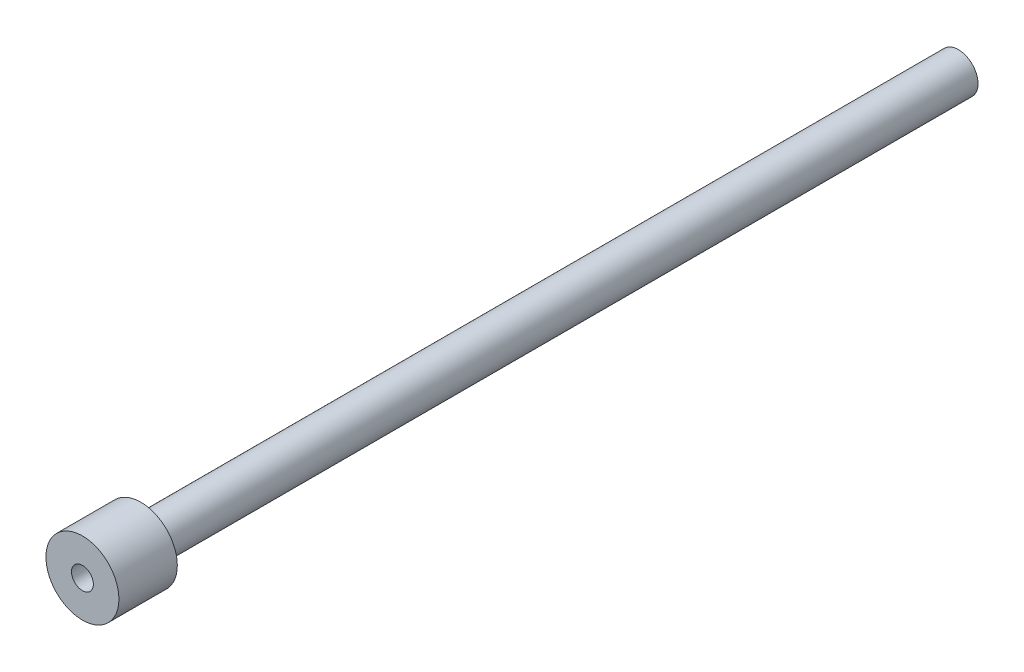
ISO-10303-21;
HEADER;
FILE_DESCRIPTION(('STEP AP214'),'2;1');
FILE_NAME('part.step','',(''),(''),'','','');
FILE_SCHEMA(('AUTOMOTIVE_DESIGN { 1 0 10303 214 1 1 1 1 }'));
ENDSEC;
DATA;
#1=APPLICATION_CONTEXT('core data for automotive mechanical design processes');
#2=APPLICATION_PROTOCOL_DEFINITION('international standard','automotive_design',2000,#1);
#3=PRODUCT_CONTEXT('',#1,'mechanical');
#4=PRODUCT('Part','Part','',(#3));
#5=PRODUCT_RELATED_PRODUCT_CATEGORY('part','',(#4));
#6=PRODUCT_DEFINITION_FORMATION('','',#4);
#7=PRODUCT_DEFINITION_CONTEXT('part definition',#1,'design');
#8=PRODUCT_DEFINITION('design','',#6,#7);
#9=PRODUCT_DEFINITION_SHAPE('','',#8);
#10=(LENGTH_UNIT() NAMED_UNIT(*) SI_UNIT(.MILLI.,.METRE.));
#11=(NAMED_UNIT(*) PLANE_ANGLE_UNIT() SI_UNIT($,.RADIAN.));
#12=(NAMED_UNIT(*) SI_UNIT($,.STERADIAN.) SOLID_ANGLE_UNIT());
#13=UNCERTAINTY_MEASURE_WITH_UNIT(LENGTH_MEASURE(1.E-05),#10,'distance_accuracy_value','');
#14=(GEOMETRIC_REPRESENTATION_CONTEXT(3) GLOBAL_UNCERTAINTY_ASSIGNED_CONTEXT((#13)) GLOBAL_UNIT_ASSIGNED_CONTEXT((#10,
#11,#12)) REPRESENTATION_CONTEXT('',''));
#15=CARTESIAN_POINT('',(0.,0.,0.));
#16=DIRECTION('',(0.,0.,1.));
#17=DIRECTION('',(1.,0.,0.));
#18=AXIS2_PLACEMENT_3D('',#15,#16,#17);
#19=CARTESIAN_POINT('',(0.,0.,20.));
#20=DIRECTION('',(0.,0.,-1.));
#21=DIRECTION('',(-1.,0.,0.));
#22=AXIS2_PLACEMENT_3D('',#19,#20,#21);
#23=CYLINDRICAL_SURFACE('',#22,12.5);
#24=CARTESIAN_POINT('',(0.,0.,20.));
#25=DIRECTION('',(0.,0.,1.));
#26=DIRECTION('',(1.,0.,0.));
#27=AXIS2_PLACEMENT_3D('',#24,#25,#26);
#28=CIRCLE('',#27,12.5);
#29=CARTESIAN_POINT('',(12.5,0.,20.));
#30=VERTEX_POINT('',#29);
#31=EDGE_CURVE('E10',#30,#30,#28,.T.);
#32=ORIENTED_EDGE('',*,*,#31,.F.);
#33=EDGE_LOOP('',(#32));
#34=FACE_BOUND('',#33,.T.);
#35=CARTESIAN_POINT('',(0.,0.,0.));
#36=DIRECTION('',(0.,0.,1.));
#37=DIRECTION('',(1.,0.,0.));
#38=AXIS2_PLACEMENT_3D('',#35,#36,#37);
#39=CIRCLE('',#38,12.5);
#40=CARTESIAN_POINT('',(12.5,0.,0.));
#41=VERTEX_POINT('',#40);
#42=EDGE_CURVE('E34',#41,#41,#39,.T.);
#43=ORIENTED_EDGE('',*,*,#42,.T.);
#44=EDGE_LOOP('',(#43));
#45=FACE_BOUND('',#44,.T.);
#46=ADVANCED_FACE('F31',(#34,#45),#23,.T.);
#47=CARTESIAN_POINT('',(0.,0.,20.));
#48=DIRECTION('',(0.,0.,1.));
#49=DIRECTION('',(1.,0.,0.));
#50=AXIS2_PLACEMENT_3D('',#47,#48,#49);
#51=PLANE('',#50);
#52=CARTESIAN_POINT('',(0.,0.,20.));
#53=DIRECTION('',(0.,0.,1.));
#54=DIRECTION('',(1.,0.,0.));
#55=AXIS2_PLACEMENT_3D('',#52,#53,#54);
#56=CIRCLE('',#55,3.75);
#57=CARTESIAN_POINT('',(3.75,0.,20.));
#58=VERTEX_POINT('',#57);
#59=EDGE_CURVE('E51',#58,#58,#56,.T.);
#60=ORIENTED_EDGE('',*,*,#59,.F.);
#61=EDGE_LOOP('',(#60));
#62=FACE_BOUND('',#61,.T.);
#63=ORIENTED_EDGE('',*,*,#31,.T.);
#64=EDGE_LOOP('',(#63));
#65=FACE_BOUND('',#64,.T.);
#66=ADVANCED_FACE('F74',(#62,#65),#51,.T.);
#67=CARTESIAN_POINT('',(0.,0.,0.));
#68=DIRECTION('',(0.,0.,1.));
#69=DIRECTION('',(1.,0.,0.));
#70=AXIS2_PLACEMENT_3D('',#67,#68,#69);
#71=PLANE('',#70);
#72=CARTESIAN_POINT('',(0.,0.,0.));
#73=DIRECTION('',(0.,0.,-1.));
#74=DIRECTION('',(-1.,0.,0.));
#75=AXIS2_PLACEMENT_3D('',#72,#73,#74);
#76=CIRCLE('',#75,10.5);
#77=CARTESIAN_POINT('',(-10.5,0.,0.));
#78=VERTEX_POINT('',#77);
#79=EDGE_CURVE('E43',#78,#78,#76,.T.);
#80=ORIENTED_EDGE('',*,*,#79,.F.);
#81=EDGE_LOOP('',(#80));
#82=FACE_BOUND('',#81,.T.);
#83=ORIENTED_EDGE('',*,*,#42,.F.);
#84=EDGE_LOOP('',(#83));
#85=FACE_BOUND('',#84,.T.);
#86=ADVANCED_FACE('F79',(#82,#85),#71,.F.);
#87=CARTESIAN_POINT('',(0.,0.,15.));
#88=DIRECTION('',(0.,0.,-1.));
#89=DIRECTION('',(-1.,0.,0.));
#90=AXIS2_PLACEMENT_3D('',#87,#88,#89);
#91=CYLINDRICAL_SURFACE('',#90,10.5);
#92=CARTESIAN_POINT('',(0.,0.,15.));
#93=DIRECTION('',(0.,0.,-1.));
#94=DIRECTION('',(-1.,0.,0.));
#95=AXIS2_PLACEMENT_3D('',#92,#93,#94);
#96=CIRCLE('',#95,10.5);
#97=CARTESIAN_POINT('',(-10.5,0.,15.));
#98=VERTEX_POINT('',#97);
#99=EDGE_CURVE('E41',#98,#98,#96,.T.);
#100=ORIENTED_EDGE('',*,*,#99,.F.);
#101=EDGE_LOOP('',(#100));
#102=FACE_BOUND('',#101,.T.);
#103=ORIENTED_EDGE('',*,*,#79,.T.);
#104=EDGE_LOOP('',(#103));
#105=FACE_BOUND('',#104,.T.);
#106=ADVANCED_FACE('F86',(#102,#105),#91,.F.);
#107=CARTESIAN_POINT('',(0.,0.,15.));
#108=DIRECTION('',(0.,0.,-1.));
#109=DIRECTION('',(-1.,0.,0.));
#110=AXIS2_PLACEMENT_3D('',#107,#108,#109);
#111=PLANE('',#110);
#112=CARTESIAN_POINT('',(0.,0.,15.));
#113=DIRECTION('',(0.,0.,-1.));
#114=DIRECTION('',(-1.,0.,0.));
#115=AXIS2_PLACEMENT_3D('',#112,#113,#114);
#116=CIRCLE('',#115,6.75);
#117=CARTESIAN_POINT('',(-6.75,0.,15.));
#118=VERTEX_POINT('',#117);
#119=EDGE_CURVE('E46',#118,#118,#116,.T.);
#120=ORIENTED_EDGE('',*,*,#119,.F.);
#121=EDGE_LOOP('',(#120));
#122=FACE_BOUND('',#121,.T.);
#123=ORIENTED_EDGE('',*,*,#99,.T.);
#124=EDGE_LOOP('',(#123));
#125=FACE_BOUND('',#124,.T.);
#126=ADVANCED_FACE('F91',(#122,#125),#111,.T.);
#127=CARTESIAN_POINT('',(0.,0.,15.));
#128=DIRECTION('',(0.,0.,-1.));
#129=DIRECTION('',(-1.,0.,0.));
#130=AXIS2_PLACEMENT_3D('',#127,#128,#129);
#131=CYLINDRICAL_SURFACE('',#130,6.75);
#132=ORIENTED_EDGE('',*,*,#119,.T.);
#133=EDGE_LOOP('',(#132));
#134=FACE_BOUND('',#133,.T.);
#135=CARTESIAN_POINT('',(0.,0.,-280.));
#136=DIRECTION('',(0.,0.,-1.));
#137=DIRECTION('',(-1.,0.,0.));
#138=AXIS2_PLACEMENT_3D('',#135,#136,#137);
#139=CIRCLE('',#138,6.75);
#140=CARTESIAN_POINT('',(-6.75,0.,-280.));
#141=VERTEX_POINT('',#140);
#142=EDGE_CURVE('E54',#141,#141,#139,.T.);
#143=ORIENTED_EDGE('',*,*,#142,.F.);
#144=EDGE_LOOP('',(#143));
#145=FACE_BOUND('',#144,.T.);
#146=ADVANCED_FACE('F70',(#134,#145),#131,.T.);
#147=CARTESIAN_POINT('',(0.,0.,0.));
#148=DIRECTION('',(0.,0.,1.));
#149=DIRECTION('',(1.,0.,0.));
#150=AXIS2_PLACEMENT_3D('',#147,#148,#149);
#151=CYLINDRICAL_SURFACE('',#150,3.75);
#152=ORIENTED_EDGE('',*,*,#59,.T.);
#153=EDGE_LOOP('',(#152));
#154=FACE_BOUND('',#153,.T.);
#155=CARTESIAN_POINT('',(0.,0.,-280.));
#156=DIRECTION('',(0.,0.,-1.));
#157=DIRECTION('',(-1.,0.,0.));
#158=AXIS2_PLACEMENT_3D('',#155,#156,#157);
#159=CIRCLE('',#158,3.75);
#160=CARTESIAN_POINT('',(-3.75,0.,-280.));
#161=VERTEX_POINT('',#160);
#162=EDGE_CURVE('E57',#161,#161,#159,.T.);
#163=ORIENTED_EDGE('',*,*,#162,.T.);
#164=EDGE_LOOP('',(#163));
#165=FACE_BOUND('',#164,.T.);
#166=ADVANCED_FACE('F61',(#154,#165),#151,.F.);
#167=CARTESIAN_POINT('',(0.,0.,-280.));
#168=DIRECTION('',(0.,0.,-1.));
#169=DIRECTION('',(-1.,0.,0.));
#170=AXIS2_PLACEMENT_3D('',#167,#168,#169);
#171=PLANE('',#170);
#172=ORIENTED_EDGE('',*,*,#142,.T.);
#173=EDGE_LOOP('',(#172));
#174=FACE_BOUND('',#173,.T.);
#175=ORIENTED_EDGE('',*,*,#162,.F.);
#176=EDGE_LOOP('',(#175));
#177=FACE_BOUND('',#176,.T.);
#178=ADVANCED_FACE('F63',(#174,#177),#171,.T.);
#179=CLOSED_SHELL('',(#46,#66,#86,#106,#126,#146,#166,#178));
#180=MANIFOLD_SOLID_BREP('B2',#179);
#181=ADVANCED_BREP_SHAPE_REPRESENTATION('',(#18,#180),#14);
#182=SHAPE_DEFINITION_REPRESENTATION(#9,#181);
ENDSEC;
END-ISO-10303-21;
